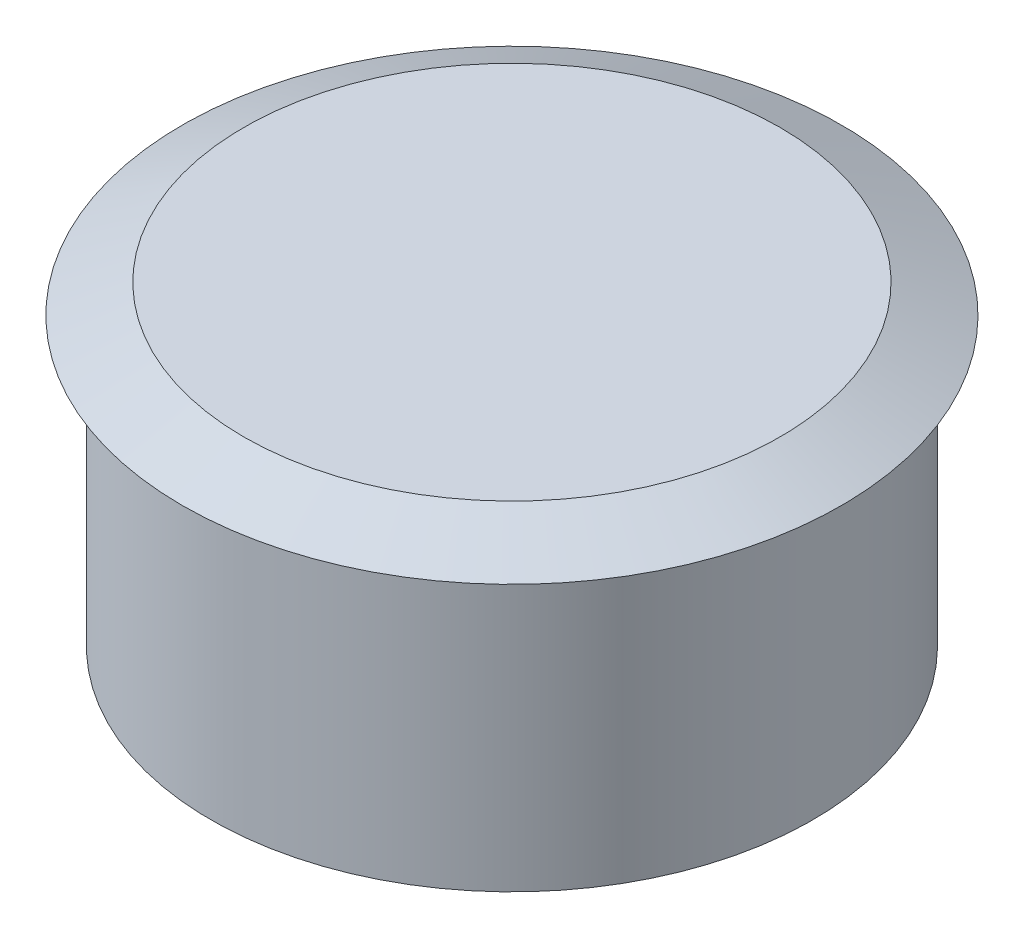
ISO-10303-21;
HEADER;
FILE_DESCRIPTION(('STEP AP214'),'2;1');
FILE_NAME('part.step','',(''),(''),'','','');
FILE_SCHEMA(('AUTOMOTIVE_DESIGN { 1 0 10303 214 1 1 1 1 }'));
ENDSEC;
DATA;
#1=APPLICATION_CONTEXT('core data for automotive mechanical design processes');
#2=APPLICATION_PROTOCOL_DEFINITION('international standard','automotive_design',2000,#1);
#3=PRODUCT_CONTEXT('',#1,'mechanical');
#4=PRODUCT('Part','Part','',(#3));
#5=PRODUCT_RELATED_PRODUCT_CATEGORY('part','',(#4));
#6=PRODUCT_DEFINITION_FORMATION('','',#4);
#7=PRODUCT_DEFINITION_CONTEXT('part definition',#1,'design');
#8=PRODUCT_DEFINITION('design','',#6,#7);
#9=PRODUCT_DEFINITION_SHAPE('','',#8);
#10=(LENGTH_UNIT() NAMED_UNIT(*) SI_UNIT(.MILLI.,.METRE.));
#11=(NAMED_UNIT(*) PLANE_ANGLE_UNIT() SI_UNIT($,.RADIAN.));
#12=(NAMED_UNIT(*) SI_UNIT($,.STERADIAN.) SOLID_ANGLE_UNIT());
#13=UNCERTAINTY_MEASURE_WITH_UNIT(LENGTH_MEASURE(1.E-05),#10,'distance_accuracy_value','');
#14=(GEOMETRIC_REPRESENTATION_CONTEXT(3) GLOBAL_UNCERTAINTY_ASSIGNED_CONTEXT((#13)) GLOBAL_UNIT_ASSIGNED_CONTEXT((#10,
#11,#12)) REPRESENTATION_CONTEXT('',''));
#15=CARTESIAN_POINT('',(0.,0.,0.));
#16=DIRECTION('',(0.,0.,1.));
#17=DIRECTION('',(1.,0.,0.));
#18=AXIS2_PLACEMENT_3D('',#15,#16,#17);
#19=CARTESIAN_POINT('',(0.,0.,0.));
#20=DIRECTION('',(0.,-1.,0.));
#21=DIRECTION('',(0.,0.,1.));
#22=AXIS2_PLACEMENT_3D('',#19,#20,#21);
#23=CONICAL_SURFACE('',#22,11.5,1.13446401379632);
#24=CARTESIAN_POINT('',(0.,1.,0.));
#25=DIRECTION('',(0.,1.,0.));
#26=DIRECTION('',(0.,0.,1.));
#27=AXIS2_PLACEMENT_3D('',#24,#25,#26);
#28=CIRCLE('',#27,9.35549307949044);
#29=CARTESIAN_POINT('',(0.,1.,9.35549307949044));
#30=VERTEX_POINT('',#29);
#31=EDGE_CURVE('E11',#30,#30,#28,.T.);
#32=ORIENTED_EDGE('',*,*,#31,.F.);
#33=EDGE_LOOP('',(#32));
#34=FACE_BOUND('',#33,.T.);
#35=CARTESIAN_POINT('',(0.,0.,0.));
#36=DIRECTION('',(0.,1.,0.));
#37=DIRECTION('',(0.,0.,1.));
#38=AXIS2_PLACEMENT_3D('',#35,#36,#37);
#39=CIRCLE('',#38,11.5);
#40=CARTESIAN_POINT('',(0.,0.,11.5));
#41=VERTEX_POINT('',#40);
#42=EDGE_CURVE('E38',#41,#41,#39,.T.);
#43=ORIENTED_EDGE('',*,*,#42,.T.);
#44=EDGE_LOOP('',(#43));
#45=FACE_BOUND('',#44,.T.);
#46=ADVANCED_FACE('F32',(#34,#45),#23,.T.);
#47=CARTESIAN_POINT('',(0.,1.,0.));
#48=DIRECTION('',(0.,1.,0.));
#49=DIRECTION('',(0.,0.,1.));
#50=AXIS2_PLACEMENT_3D('',#47,#48,#49);
#51=PLANE('',#50);
#52=ORIENTED_EDGE('',*,*,#31,.T.);
#53=EDGE_LOOP('',(#52));
#54=FACE_BOUND('',#53,.T.);
#55=ADVANCED_FACE('F59',(#54),#51,.T.);
#56=CARTESIAN_POINT('',(0.,0.,0.));
#57=DIRECTION('',(0.,1.,0.));
#58=DIRECTION('',(0.,0.,1.));
#59=AXIS2_PLACEMENT_3D('',#56,#57,#58);
#60=PLANE('',#59);
#61=CARTESIAN_POINT('',(0.,0.,0.));
#62=DIRECTION('',(0.,-1.,0.));
#63=DIRECTION('',(0.,0.,-1.));
#64=AXIS2_PLACEMENT_3D('',#61,#62,#63);
#65=CIRCLE('',#64,10.5);
#66=CARTESIAN_POINT('',(0.,0.,-10.5));
#67=VERTEX_POINT('',#66);
#68=EDGE_CURVE('E46',#67,#67,#65,.T.);
#69=ORIENTED_EDGE('',*,*,#68,.F.);
#70=EDGE_LOOP('',(#69));
#71=FACE_BOUND('',#70,.T.);
#72=ORIENTED_EDGE('',*,*,#42,.F.);
#73=EDGE_LOOP('',(#72));
#74=FACE_BOUND('',#73,.T.);
#75=ADVANCED_FACE('F55',(#71,#74),#60,.F.);
#76=CARTESIAN_POINT('',(0.,-10.,0.));
#77=DIRECTION('',(0.,-1.,0.));
#78=DIRECTION('',(0.,0.,-1.));
#79=AXIS2_PLACEMENT_3D('',#76,#77,#78);
#80=PLANE('',#79);
#81=CARTESIAN_POINT('',(0.,-10.,0.));
#82=DIRECTION('',(0.,-1.,0.));
#83=DIRECTION('',(0.,0.,-1.));
#84=AXIS2_PLACEMENT_3D('',#81,#82,#83);
#85=CIRCLE('',#84,10.5);
#86=CARTESIAN_POINT('',(0.,-10.,-10.5));
#87=VERTEX_POINT('',#86);
#88=EDGE_CURVE('E42',#87,#87,#85,.T.);
#89=ORIENTED_EDGE('',*,*,#88,.T.);
#90=EDGE_LOOP('',(#89));
#91=FACE_BOUND('',#90,.T.);
#92=ADVANCED_FACE('F58',(#91),#80,.T.);
#93=CARTESIAN_POINT('',(0.,0.,0.));
#94=DIRECTION('',(0.,-1.,0.));
#95=DIRECTION('',(0.,0.,-1.));
#96=AXIS2_PLACEMENT_3D('',#93,#94,#95);
#97=CYLINDRICAL_SURFACE('',#96,10.5);
#98=CARTESIAN_POINT('',(0.,0.,-10.5));
#99=CARTESIAN_POINT('',(0.,-0.104166666666667,-10.5));
#100=CARTESIAN_POINT('',(0.,-0.208333333333333,-10.5));
#101=CARTESIAN_POINT('',(0.,-0.416666666666667,-10.5));
#102=CARTESIAN_POINT('',(0.,-0.520833333333333,-10.5));
#103=CARTESIAN_POINT('',(0.,-0.729166666666667,-10.5));
#104=CARTESIAN_POINT('',(0.,-0.833333333333333,-10.5));
#105=CARTESIAN_POINT('',(0.,-1.04166666666667,-10.5));
#106=CARTESIAN_POINT('',(0.,-1.14583333333333,-10.5));
#107=CARTESIAN_POINT('',(0.,-1.35416666666667,-10.5));
#108=CARTESIAN_POINT('',(0.,-1.45833333333333,-10.5));
#109=CARTESIAN_POINT('',(0.,-1.66666666666667,-10.5));
#110=CARTESIAN_POINT('',(0.,-1.77083333333333,-10.5));
#111=CARTESIAN_POINT('',(0.,-1.97916666666667,-10.5));
#112=CARTESIAN_POINT('',(0.,-2.08333333333333,-10.5));
#113=CARTESIAN_POINT('',(0.,-2.29166666666667,-10.5));
#114=CARTESIAN_POINT('',(0.,-2.39583333333333,-10.5));
#115=CARTESIAN_POINT('',(0.,-2.60416666666667,-10.5));
#116=CARTESIAN_POINT('',(0.,-2.70833333333333,-10.5));
#117=CARTESIAN_POINT('',(0.,-2.91666666666667,-10.5));
#118=CARTESIAN_POINT('',(0.,-3.02083333333333,-10.5));
#119=CARTESIAN_POINT('',(0.,-3.22916666666667,-10.5));
#120=CARTESIAN_POINT('',(0.,-3.33333333333333,-10.5));
#121=CARTESIAN_POINT('',(0.,-3.54166666666667,-10.5));
#122=CARTESIAN_POINT('',(0.,-3.64583333333333,-10.5));
#123=CARTESIAN_POINT('',(0.,-3.85416666666667,-10.5));
#124=CARTESIAN_POINT('',(0.,-3.95833333333333,-10.5));
#125=CARTESIAN_POINT('',(0.,-4.16666666666667,-10.5));
#126=CARTESIAN_POINT('',(0.,-4.27083333333333,-10.5));
#127=CARTESIAN_POINT('',(0.,-4.47916666666667,-10.5));
#128=CARTESIAN_POINT('',(0.,-4.58333333333333,-10.5));
#129=CARTESIAN_POINT('',(0.,-4.79166666666667,-10.5));
#130=CARTESIAN_POINT('',(0.,-4.89583333333333,-10.5));
#131=CARTESIAN_POINT('',(0.,-5.10416666666667,-10.5));
#132=CARTESIAN_POINT('',(0.,-5.20833333333333,-10.5));
#133=CARTESIAN_POINT('',(0.,-5.41666666666667,-10.5));
#134=CARTESIAN_POINT('',(0.,-5.52083333333333,-10.5));
#135=CARTESIAN_POINT('',(0.,-5.72916666666667,-10.5));
#136=CARTESIAN_POINT('',(0.,-5.83333333333333,-10.5));
#137=CARTESIAN_POINT('',(0.,-6.04166666666667,-10.5));
#138=CARTESIAN_POINT('',(0.,-6.14583333333333,-10.5));
#139=CARTESIAN_POINT('',(0.,-6.35416666666667,-10.5));
#140=CARTESIAN_POINT('',(0.,-6.45833333333333,-10.5));
#141=CARTESIAN_POINT('',(0.,-6.66666666666667,-10.5));
#142=CARTESIAN_POINT('',(0.,-6.77083333333333,-10.5));
#143=CARTESIAN_POINT('',(0.,-6.97916666666667,-10.5));
#144=CARTESIAN_POINT('',(0.,-7.08333333333333,-10.5));
#145=CARTESIAN_POINT('',(0.,-7.29166666666667,-10.5));
#146=CARTESIAN_POINT('',(0.,-7.39583333333333,-10.5));
#147=CARTESIAN_POINT('',(0.,-7.60416666666667,-10.5));
#148=CARTESIAN_POINT('',(0.,-7.70833333333333,-10.5));
#149=CARTESIAN_POINT('',(0.,-7.91666666666667,-10.5));
#150=CARTESIAN_POINT('',(0.,-8.02083333333333,-10.5));
#151=CARTESIAN_POINT('',(0.,-8.22916666666667,-10.5));
#152=CARTESIAN_POINT('',(0.,-8.33333333333333,-10.5));
#153=CARTESIAN_POINT('',(0.,-8.54166666666667,-10.5));
#154=CARTESIAN_POINT('',(0.,-8.64583333333333,-10.5));
#155=CARTESIAN_POINT('',(0.,-8.85416666666667,-10.5));
#156=CARTESIAN_POINT('',(0.,-8.95833333333333,-10.5));
#157=CARTESIAN_POINT('',(0.,-9.16666666666666,-10.5));
#158=CARTESIAN_POINT('',(0.,-9.27083333333333,-10.5));
#159=CARTESIAN_POINT('',(0.,-9.47916666666667,-10.5));
#160=CARTESIAN_POINT('',(0.,-9.58333333333333,-10.5));
#161=CARTESIAN_POINT('',(0.,-9.79166666666667,-10.5));
#162=CARTESIAN_POINT('',(0.,-9.89583333333333,-10.5));
#163=CARTESIAN_POINT('',(0.,-10.,-10.5));
#164=B_SPLINE_CURVE_WITH_KNOTS('',3,(#98,#99,#100,#101,#102,#103,#104,#105,#106,#107,#108,#109,
#110,#111,#112,#113,#114,#115,#116,#117,#118,#119,#120,#121,#122,#123,#124,#125,#126,#127,#128,
#129,#130,#131,#132,#133,#134,#135,#136,#137,#138,#139,#140,#141,#142,#143,#144,#145,#146,#147,
#148,#149,#150,#151,#152,#153,#154,#155,#156,#157,#158,#159,#160,#161,#162,#163),.UNSPECIFIED.,
.F.,.F.,(4,2,2,2,2,2,2,2,2,2,2,2,2,2,2,2,2,2,2,2,2,2,2,2,2,2,2,2,2,2,2,2,4),(0.,0.3125,0.625,
0.9375,1.25,1.5625,1.875,2.1875,2.5,2.8125,3.125,3.4375,3.75,4.0625,4.375,4.6875,5.,5.3125,
5.625,5.9375,6.25,6.5625,6.875,7.1875,7.5,7.8125,8.125,8.4375,8.75,9.0625,9.375,9.6875,10.),.UNSPECIFIED.);
#165=EDGE_CURVE('BSEAM52',#67,#87,#164,.T.);
#166=ORIENTED_EDGE('',*,*,#68,.T.);
#167=ORIENTED_EDGE('',*,*,#88,.F.);
#168=ORIENTED_EDGE('',*,*,#165,.T.);
#169=ORIENTED_EDGE('',*,*,#165,.F.);
#170=EDGE_LOOP('',(#166,#168,#167,#169));
#171=FACE_BOUND('',#170,.T.);
#172=ADVANCED_FACE('F52',(#171),#97,.T.);
#173=CLOSED_SHELL('',(#46,#55,#75,#92,#172));
#174=MANIFOLD_SOLID_BREP('B2',#173);
#175=ADVANCED_BREP_SHAPE_REPRESENTATION('',(#18,#174),#14);
#176=SHAPE_DEFINITION_REPRESENTATION(#9,#175);
ENDSEC;
END-ISO-10303-21;
